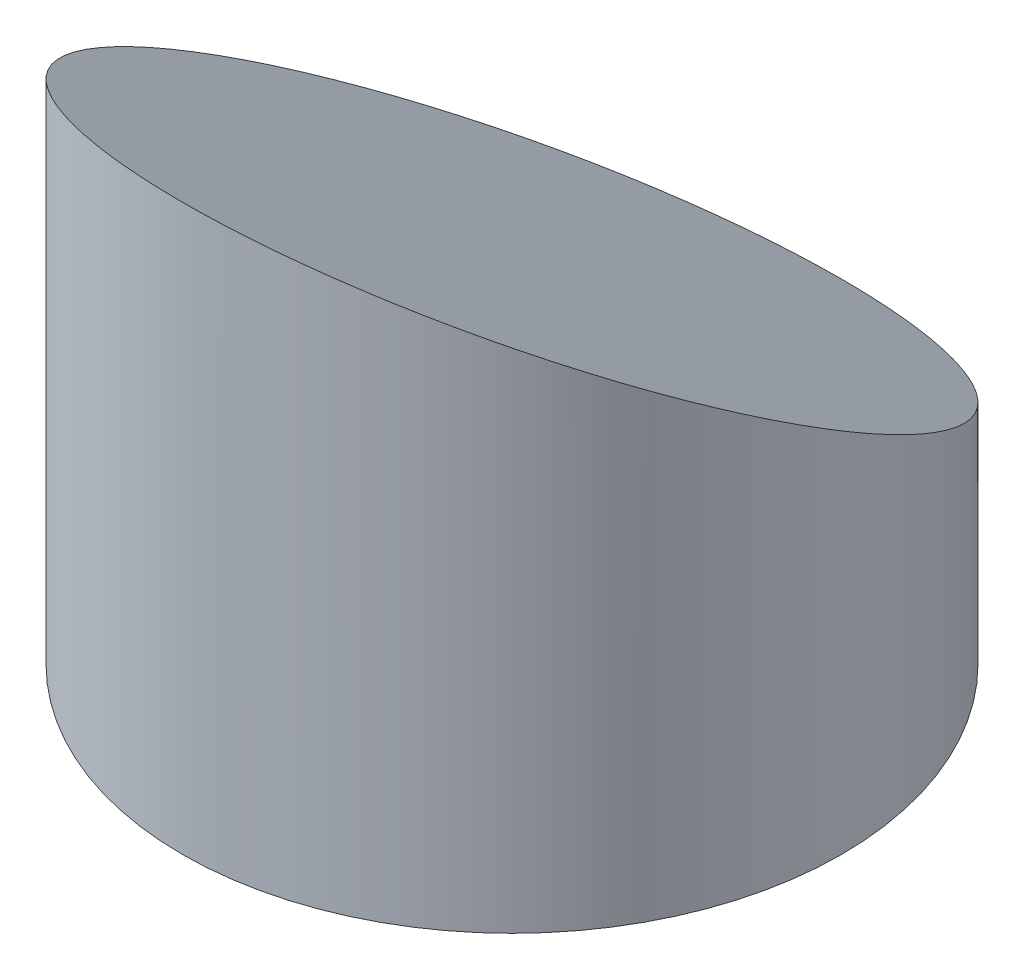
ISO-10303-21;
HEADER;
FILE_DESCRIPTION(('STEP AP214'),'2;1');
FILE_NAME('part.step','',(''),(''),'','','');
FILE_SCHEMA(('AUTOMOTIVE_DESIGN { 1 0 10303 214 1 1 1 1 }'));
ENDSEC;
DATA;
#1=APPLICATION_CONTEXT('core data for automotive mechanical design processes');
#2=APPLICATION_PROTOCOL_DEFINITION('international standard','automotive_design',2000,#1);
#3=PRODUCT_CONTEXT('',#1,'mechanical');
#4=PRODUCT('Part','Part','',(#3));
#5=PRODUCT_RELATED_PRODUCT_CATEGORY('part','',(#4));
#6=PRODUCT_DEFINITION_FORMATION('','',#4);
#7=PRODUCT_DEFINITION_CONTEXT('part definition',#1,'design');
#8=PRODUCT_DEFINITION('design','',#6,#7);
#9=PRODUCT_DEFINITION_SHAPE('','',#8);
#10=(LENGTH_UNIT() NAMED_UNIT(*) SI_UNIT(.MILLI.,.METRE.));
#11=(NAMED_UNIT(*) PLANE_ANGLE_UNIT() SI_UNIT($,.RADIAN.));
#12=(NAMED_UNIT(*) SI_UNIT($,.STERADIAN.) SOLID_ANGLE_UNIT());
#13=UNCERTAINTY_MEASURE_WITH_UNIT(LENGTH_MEASURE(1.E-05),#10,'distance_accuracy_value','');
#14=(GEOMETRIC_REPRESENTATION_CONTEXT(3) GLOBAL_UNCERTAINTY_ASSIGNED_CONTEXT((#13)) GLOBAL_UNIT_ASSIGNED_CONTEXT((#10,
#11,#12)) REPRESENTATION_CONTEXT('',''));
#15=CARTESIAN_POINT('',(0.,0.,0.));
#16=DIRECTION('',(0.,0.,1.));
#17=DIRECTION('',(1.,0.,0.));
#18=AXIS2_PLACEMENT_3D('',#15,#16,#17);
#19=CARTESIAN_POINT('',(0.,6.,0.));
#20=DIRECTION('',(0.,-1.,0.));
#21=DIRECTION('',(0.,0.,-1.));
#22=AXIS2_PLACEMENT_3D('',#19,#20,#21);
#23=CYLINDRICAL_SURFACE('',#22,3.5);
#24=CARTESIAN_POINT('',(0.,0.,0.));
#25=DIRECTION('',(0.,1.,0.));
#26=DIRECTION('',(0.,0.,1.));
#27=AXIS2_PLACEMENT_3D('',#24,#25,#26);
#28=CIRCLE('',#27,3.5);
#29=CARTESIAN_POINT('',(0.,0.,3.5));
#30=VERTEX_POINT('',#29);
#31=EDGE_CURVE('E10',#30,#30,#28,.T.);
#32=ORIENTED_EDGE('',*,*,#31,.T.);
#33=EDGE_LOOP('',(#32));
#34=FACE_BOUND('',#33,.T.);
#35=CARTESIAN_POINT('',(0.,3.89698783340357,0.));
#36=DIRECTION('',(0.,0.857167300702116,-0.515038074910049));
#37=DIRECTION('',(0.,-0.515038074910049,-0.857167300702116));
#38=AXIS2_PLACEMENT_3D('',#35,#36,#37);
#39=ELLIPSE('',#38,4.08321689025364,3.5);
#40=CARTESIAN_POINT('',(0.,1.79397566680714,-3.5));
#41=VERTEX_POINT('',#40);
#42=EDGE_CURVE('E50',#41,#41,#39,.T.);
#43=ORIENTED_EDGE('',*,*,#42,.F.);
#44=EDGE_LOOP('',(#43));
#45=FACE_BOUND('',#44,.T.);
#46=ADVANCED_FACE('F43',(#34,#45),#23,.T.);
#47=CARTESIAN_POINT('',(0.,0.,0.));
#48=DIRECTION('',(0.,1.,0.));
#49=DIRECTION('',(0.,0.,1.));
#50=AXIS2_PLACEMENT_3D('',#47,#48,#49);
#51=PLANE('',#50);
#52=ORIENTED_EDGE('',*,*,#31,.F.);
#53=EDGE_LOOP('',(#52));
#54=FACE_BOUND('',#53,.T.);
#55=ADVANCED_FACE('F60',(#54),#51,.F.);
#56=CARTESIAN_POINT('',(14.4697961284878,6.,3.5));
#57=DIRECTION('',(0.,0.857167300702116,-0.515038074910049));
#58=DIRECTION('',(0.,0.515038074910049,0.857167300702116));
#59=AXIS2_PLACEMENT_3D('',#56,#57,#58);
#60=PLANE('',#59);
#61=ORIENTED_EDGE('',*,*,#42,.T.);
#62=EDGE_LOOP('',(#61));
#63=FACE_BOUND('',#62,.T.);
#64=ADVANCED_FACE('F57',(#63),#60,.T.);
#65=CLOSED_SHELL('',(#46,#55,#64));
#66=MANIFOLD_SOLID_BREP('B2',#65);
#67=ADVANCED_BREP_SHAPE_REPRESENTATION('',(#18,#66),#14);
#68=SHAPE_DEFINITION_REPRESENTATION(#9,#67);
ENDSEC;
END-ISO-10303-21;
